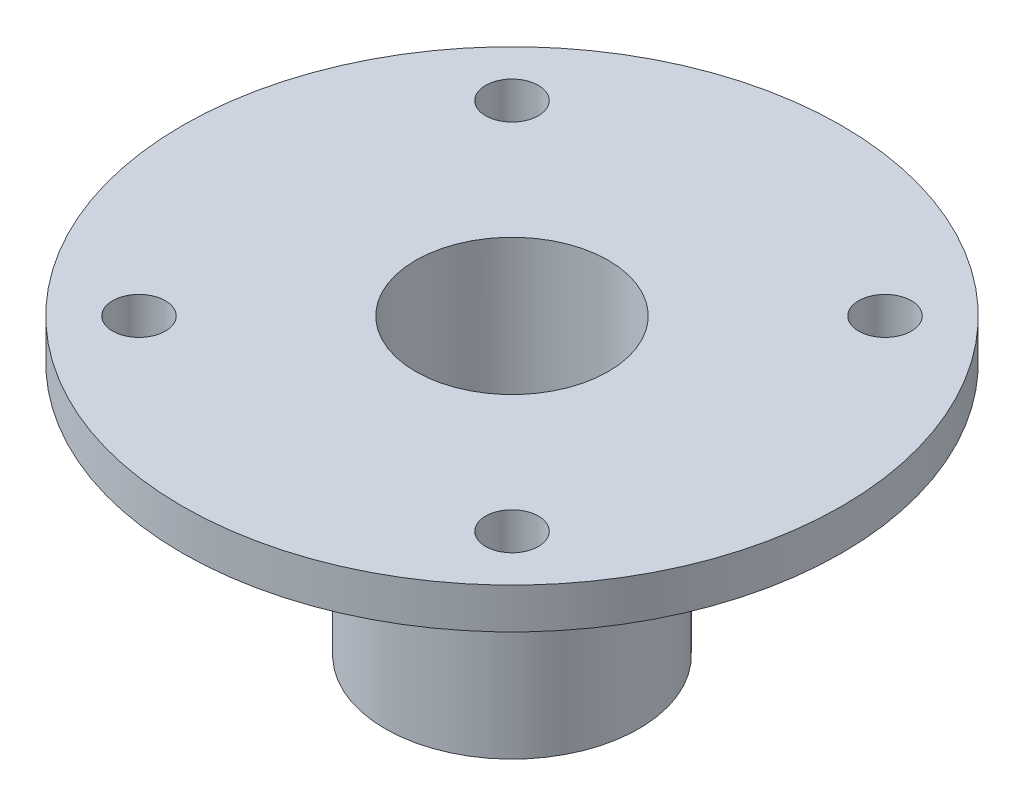
ISO-10303-21;
HEADER;
FILE_DESCRIPTION(('STEP AP214'),'2;1');
FILE_NAME('part.step','',(''),(''),'','','');
FILE_SCHEMA(('AUTOMOTIVE_DESIGN { 1 0 10303 214 1 1 1 1 }'));
ENDSEC;
DATA;
#1=APPLICATION_CONTEXT('core data for automotive mechanical design processes');
#2=APPLICATION_PROTOCOL_DEFINITION('international standard','automotive_design',2000,#1);
#3=PRODUCT_CONTEXT('',#1,'mechanical');
#4=PRODUCT('Part','Part','',(#3));
#5=PRODUCT_RELATED_PRODUCT_CATEGORY('part','',(#4));
#6=PRODUCT_DEFINITION_FORMATION('','',#4);
#7=PRODUCT_DEFINITION_CONTEXT('part definition',#1,'design');
#8=PRODUCT_DEFINITION('design','',#6,#7);
#9=PRODUCT_DEFINITION_SHAPE('','',#8);
#10=(LENGTH_UNIT() NAMED_UNIT(*) SI_UNIT(.MILLI.,.METRE.));
#11=(NAMED_UNIT(*) PLANE_ANGLE_UNIT() SI_UNIT($,.RADIAN.));
#12=(NAMED_UNIT(*) SI_UNIT($,.STERADIAN.) SOLID_ANGLE_UNIT());
#13=UNCERTAINTY_MEASURE_WITH_UNIT(LENGTH_MEASURE(1.E-05),#10,'distance_accuracy_value','');
#14=(GEOMETRIC_REPRESENTATION_CONTEXT(3) GLOBAL_UNCERTAINTY_ASSIGNED_CONTEXT((#13)) GLOBAL_UNIT_ASSIGNED_CONTEXT((#10,
#11,#12)) REPRESENTATION_CONTEXT('',''));
#15=CARTESIAN_POINT('',(0.,0.,0.));
#16=DIRECTION('',(0.,0.,1.));
#17=DIRECTION('',(1.,0.,0.));
#18=AXIS2_PLACEMENT_3D('',#15,#16,#17);
#19=CARTESIAN_POINT('',(0.,0.,0.));
#20=DIRECTION('',(0.,1.,0.));
#21=DIRECTION('',(0.,0.,1.));
#22=AXIS2_PLACEMENT_3D('',#19,#20,#21);
#23=PLANE('',#22);
#24=CARTESIAN_POINT('',(0.,0.,0.));
#25=DIRECTION('',(0.,1.,0.));
#26=DIRECTION('',(0.,0.,1.));
#27=AXIS2_PLACEMENT_3D('',#24,#25,#26);
#28=CIRCLE('',#27,14.5);
#29=CARTESIAN_POINT('',(0.,0.,14.5));
#30=VERTEX_POINT('',#29);
#31=EDGE_CURVE('E10',#30,#30,#28,.T.);
#32=ORIENTED_EDGE('',*,*,#31,.T.);
#33=EDGE_LOOP('',(#32));
#34=FACE_BOUND('',#33,.T.);
#35=CARTESIAN_POINT('',(18.3847763108502,0.,-18.3847763108502));
#36=DIRECTION('',(0.,1.,0.));
#37=DIRECTION('',(0.,0.,1.));
#38=AXIS2_PLACEMENT_3D('',#35,#36,#37);
#39=CIRCLE('',#38,2.6);
#40=CARTESIAN_POINT('',(18.3847763108502,0.,-15.7847763108502));
#41=VERTEX_POINT('',#40);
#42=EDGE_CURVE('E75',#41,#41,#39,.T.);
#43=ORIENTED_EDGE('',*,*,#42,.T.);
#44=EDGE_LOOP('',(#43));
#45=FACE_BOUND('',#44,.T.);
#46=CARTESIAN_POINT('',(-18.3847763108502,0.,18.3847763108502));
#47=DIRECTION('',(0.,1.,0.));
#48=DIRECTION('',(0.,0.,1.));
#49=AXIS2_PLACEMENT_3D('',#46,#47,#48);
#50=CIRCLE('',#49,2.6);
#51=CARTESIAN_POINT('',(-18.3847763108502,0.,20.9847763108502));
#52=VERTEX_POINT('',#51);
#53=EDGE_CURVE('E63',#52,#52,#50,.T.);
#54=ORIENTED_EDGE('',*,*,#53,.T.);
#55=EDGE_LOOP('',(#54));
#56=FACE_BOUND('',#55,.T.);
#57=CARTESIAN_POINT('',(0.,0.,0.));
#58=DIRECTION('',(0.,1.,0.));
#59=DIRECTION('',(0.,0.,1.));
#60=AXIS2_PLACEMENT_3D('',#57,#58,#59);
#61=CIRCLE('',#60,32.5);
#62=CARTESIAN_POINT('',(0.,0.,32.5));
#63=VERTEX_POINT('',#62);
#64=EDGE_CURVE('E48',#63,#63,#61,.T.);
#65=ORIENTED_EDGE('',*,*,#64,.F.);
#66=EDGE_LOOP('',(#65));
#67=FACE_BOUND('',#66,.T.);
#68=CARTESIAN_POINT('',(18.3847763108502,0.,18.3847763108502));
#69=DIRECTION('',(0.,1.,0.));
#70=DIRECTION('',(0.,0.,1.));
#71=AXIS2_PLACEMENT_3D('',#68,#69,#70);
#72=CIRCLE('',#71,2.6);
#73=CARTESIAN_POINT('',(18.3847763108502,0.,20.9847763108502));
#74=VERTEX_POINT('',#73);
#75=EDGE_CURVE('E57',#74,#74,#72,.T.);
#76=ORIENTED_EDGE('',*,*,#75,.T.);
#77=EDGE_LOOP('',(#76));
#78=FACE_BOUND('',#77,.T.);
#79=CARTESIAN_POINT('',(-18.3847763108502,0.,-18.3847763108502));
#80=DIRECTION('',(0.,1.,0.));
#81=DIRECTION('',(0.,0.,1.));
#82=AXIS2_PLACEMENT_3D('',#79,#80,#81);
#83=CIRCLE('',#82,2.6);
#84=CARTESIAN_POINT('',(-18.3847763108502,0.,-15.7847763108502));
#85=VERTEX_POINT('',#84);
#86=EDGE_CURVE('E69',#85,#85,#83,.T.);
#87=ORIENTED_EDGE('',*,*,#86,.T.);
#88=EDGE_LOOP('',(#87));
#89=FACE_BOUND('',#88,.T.);
#90=ADVANCED_FACE('F33',(#34,#45,#56,#67,#78,#89),#23,.F.);
#91=CARTESIAN_POINT('',(0.,4.,0.));
#92=DIRECTION('',(0.,1.,0.));
#93=DIRECTION('',(0.,0.,1.));
#94=AXIS2_PLACEMENT_3D('',#91,#92,#93);
#95=PLANE('',#94);
#96=CARTESIAN_POINT('',(-18.3847763108502,4.,-18.3847763108502));
#97=DIRECTION('',(0.,1.,0.));
#98=DIRECTION('',(0.,0.,1.));
#99=AXIS2_PLACEMENT_3D('',#96,#97,#98);
#100=CIRCLE('',#99,2.6);
#101=CARTESIAN_POINT('',(-18.3847763108502,4.,-15.7847763108502));
#102=VERTEX_POINT('',#101);
#103=EDGE_CURVE('E66',#102,#102,#100,.T.);
#104=ORIENTED_EDGE('',*,*,#103,.F.);
#105=EDGE_LOOP('',(#104));
#106=FACE_BOUND('',#105,.T.);
#107=CARTESIAN_POINT('',(18.3847763108502,4.,18.3847763108502));
#108=DIRECTION('',(0.,1.,0.));
#109=DIRECTION('',(0.,0.,1.));
#110=AXIS2_PLACEMENT_3D('',#107,#108,#109);
#111=CIRCLE('',#110,2.6);
#112=CARTESIAN_POINT('',(18.3847763108502,4.,20.9847763108502));
#113=VERTEX_POINT('',#112);
#114=EDGE_CURVE('E56',#113,#113,#111,.T.);
#115=ORIENTED_EDGE('',*,*,#114,.F.);
#116=EDGE_LOOP('',(#115));
#117=FACE_BOUND('',#116,.T.);
#118=CARTESIAN_POINT('',(0.,4.,0.));
#119=DIRECTION('',(0.,1.,0.));
#120=DIRECTION('',(0.,0.,1.));
#121=AXIS2_PLACEMENT_3D('',#118,#119,#120);
#122=CIRCLE('',#121,32.5);
#123=CARTESIAN_POINT('',(0.,4.,32.5));
#124=VERTEX_POINT('',#123);
#125=EDGE_CURVE('E44',#124,#124,#122,.T.);
#126=ORIENTED_EDGE('',*,*,#125,.T.);
#127=EDGE_LOOP('',(#126));
#128=FACE_BOUND('',#127,.T.);
#129=CARTESIAN_POINT('',(0.,4.,0.));
#130=DIRECTION('',(0.,1.,0.));
#131=DIRECTION('',(0.,0.,1.));
#132=AXIS2_PLACEMENT_3D('',#129,#130,#131);
#133=CIRCLE('',#132,9.5);
#134=CARTESIAN_POINT('',(0.,4.,9.5));
#135=VERTEX_POINT('',#134);
#136=EDGE_CURVE('E52',#135,#135,#133,.T.);
#137=ORIENTED_EDGE('',*,*,#136,.F.);
#138=EDGE_LOOP('',(#137));
#139=FACE_BOUND('',#138,.T.);
#140=CARTESIAN_POINT('',(-18.3847763108502,4.,18.3847763108502));
#141=DIRECTION('',(0.,1.,0.));
#142=DIRECTION('',(0.,0.,1.));
#143=AXIS2_PLACEMENT_3D('',#140,#141,#142);
#144=CIRCLE('',#143,2.6);
#145=CARTESIAN_POINT('',(-18.3847763108502,4.,20.9847763108502));
#146=VERTEX_POINT('',#145);
#147=EDGE_CURVE('E60',#146,#146,#144,.T.);
#148=ORIENTED_EDGE('',*,*,#147,.F.);
#149=EDGE_LOOP('',(#148));
#150=FACE_BOUND('',#149,.T.);
#151=CARTESIAN_POINT('',(18.3847763108502,4.,-18.3847763108502));
#152=DIRECTION('',(0.,1.,0.));
#153=DIRECTION('',(0.,0.,1.));
#154=AXIS2_PLACEMENT_3D('',#151,#152,#153);
#155=CIRCLE('',#154,2.6);
#156=CARTESIAN_POINT('',(18.3847763108502,4.,-15.7847763108502));
#157=VERTEX_POINT('',#156);
#158=EDGE_CURVE('E72',#157,#157,#155,.T.);
#159=ORIENTED_EDGE('',*,*,#158,.F.);
#160=EDGE_LOOP('',(#159));
#161=FACE_BOUND('',#160,.T.);
#162=ADVANCED_FACE('F115',(#106,#117,#128,#139,#150,#161),#95,.T.);
#163=CARTESIAN_POINT('',(0.,4.,0.));
#164=DIRECTION('',(0.,-1.,0.));
#165=DIRECTION('',(0.,0.,-1.));
#166=AXIS2_PLACEMENT_3D('',#163,#164,#165);
#167=CYLINDRICAL_SURFACE('',#166,32.5);
#168=ORIENTED_EDGE('',*,*,#125,.F.);
#169=EDGE_LOOP('',(#168));
#170=FACE_BOUND('',#169,.T.);
#171=ORIENTED_EDGE('',*,*,#64,.T.);
#172=EDGE_LOOP('',(#171));
#173=FACE_BOUND('',#172,.T.);
#174=ADVANCED_FACE('F120',(#170,#173),#167,.T.);
#175=CARTESIAN_POINT('',(0.,4.,0.));
#176=DIRECTION('',(0.,-1.,0.));
#177=DIRECTION('',(0.,0.,-1.));
#178=AXIS2_PLACEMENT_3D('',#175,#176,#177);
#179=CYLINDRICAL_SURFACE('',#178,9.5);
#180=ORIENTED_EDGE('',*,*,#136,.T.);
#181=EDGE_LOOP('',(#180));
#182=FACE_BOUND('',#181,.T.);
#183=CARTESIAN_POINT('',(0.,-17.,0.));
#184=DIRECTION('',(0.,-1.,0.));
#185=DIRECTION('',(0.,0.,-1.));
#186=AXIS2_PLACEMENT_3D('',#183,#184,#185);
#187=CIRCLE('',#186,9.5);
#188=CARTESIAN_POINT('',(0.,-17.,-9.5));
#189=VERTEX_POINT('',#188);
#190=EDGE_CURVE('E78',#189,#189,#187,.T.);
#191=ORIENTED_EDGE('',*,*,#190,.T.);
#192=EDGE_LOOP('',(#191));
#193=FACE_BOUND('',#192,.T.);
#194=ADVANCED_FACE('F126',(#182,#193),#179,.F.);
#195=CARTESIAN_POINT('',(18.3847763108502,4.,18.3847763108502));
#196=DIRECTION('',(0.,-1.,0.));
#197=DIRECTION('',(0.,0.,-1.));
#198=AXIS2_PLACEMENT_3D('',#195,#196,#197);
#199=CYLINDRICAL_SURFACE('',#198,2.6);
#200=ORIENTED_EDGE('',*,*,#114,.T.);
#201=EDGE_LOOP('',(#200));
#202=FACE_BOUND('',#201,.T.);
#203=ORIENTED_EDGE('',*,*,#75,.F.);
#204=EDGE_LOOP('',(#203));
#205=FACE_BOUND('',#204,.T.);
#206=ADVANCED_FACE('F131',(#202,#205),#199,.F.);
#207=CARTESIAN_POINT('',(-18.3847763108502,4.,18.3847763108502));
#208=DIRECTION('',(0.,-1.,0.));
#209=DIRECTION('',(0.,0.,-1.));
#210=AXIS2_PLACEMENT_3D('',#207,#208,#209);
#211=CYLINDRICAL_SURFACE('',#210,2.6);
#212=ORIENTED_EDGE('',*,*,#147,.T.);
#213=EDGE_LOOP('',(#212));
#214=FACE_BOUND('',#213,.T.);
#215=ORIENTED_EDGE('',*,*,#53,.F.);
#216=EDGE_LOOP('',(#215));
#217=FACE_BOUND('',#216,.T.);
#218=ADVANCED_FACE('F143',(#214,#217),#211,.F.);
#219=CARTESIAN_POINT('',(-18.3847763108502,4.,-18.3847763108502));
#220=DIRECTION('',(0.,-1.,0.));
#221=DIRECTION('',(0.,0.,-1.));
#222=AXIS2_PLACEMENT_3D('',#219,#220,#221);
#223=CYLINDRICAL_SURFACE('',#222,2.6);
#224=ORIENTED_EDGE('',*,*,#103,.T.);
#225=EDGE_LOOP('',(#224));
#226=FACE_BOUND('',#225,.T.);
#227=ORIENTED_EDGE('',*,*,#86,.F.);
#228=EDGE_LOOP('',(#227));
#229=FACE_BOUND('',#228,.T.);
#230=ADVANCED_FACE('F110',(#226,#229),#223,.F.);
#231=CARTESIAN_POINT('',(18.3847763108502,4.,-18.3847763108502));
#232=DIRECTION('',(0.,-1.,0.));
#233=DIRECTION('',(0.,0.,-1.));
#234=AXIS2_PLACEMENT_3D('',#231,#232,#233);
#235=CYLINDRICAL_SURFACE('',#234,2.6);
#236=ORIENTED_EDGE('',*,*,#158,.T.);
#237=EDGE_LOOP('',(#236));
#238=FACE_BOUND('',#237,.T.);
#239=ORIENTED_EDGE('',*,*,#42,.F.);
#240=EDGE_LOOP('',(#239));
#241=FACE_BOUND('',#240,.T.);
#242=ADVANCED_FACE('F105',(#238,#241),#235,.F.);
#243=CARTESIAN_POINT('',(0.,-17.,0.));
#244=DIRECTION('',(0.,1.,0.));
#245=DIRECTION('',(0.,0.,1.));
#246=AXIS2_PLACEMENT_3D('',#243,#244,#245);
#247=CYLINDRICAL_SURFACE('',#246,12.5);
#248=CARTESIAN_POINT('',(0.,-2.,0.));
#249=DIRECTION('',(0.,1.,0.));
#250=DIRECTION('',(0.,0.,1.));
#251=AXIS2_PLACEMENT_3D('',#248,#249,#250);
#252=CIRCLE('',#251,12.5);
#253=CARTESIAN_POINT('',(0.,-2.,12.5));
#254=VERTEX_POINT('',#253);
#255=EDGE_CURVE('E40',#254,#254,#252,.F.);
#256=ORIENTED_EDGE('',*,*,#255,.T.);
#257=EDGE_LOOP('',(#256));
#258=FACE_BOUND('',#257,.T.);
#259=CARTESIAN_POINT('',(0.,-25.,0.));
#260=DIRECTION('',(0.,-1.,0.));
#261=DIRECTION('',(0.,0.,-1.));
#262=AXIS2_PLACEMENT_3D('',#259,#260,#261);
#263=CIRCLE('',#262,12.5);
#264=CARTESIAN_POINT('',(0.,-25.,-12.5));
#265=VERTEX_POINT('',#264);
#266=EDGE_CURVE('E83',#265,#265,#263,.T.);
#267=ORIENTED_EDGE('',*,*,#266,.F.);
#268=EDGE_LOOP('',(#267));
#269=FACE_BOUND('',#268,.T.);
#270=ADVANCED_FACE('F100',(#258,#269),#247,.T.);
#271=CARTESIAN_POINT('',(0.,-25.,0.));
#272=DIRECTION('',(0.,-1.,0.));
#273=DIRECTION('',(0.,0.,-1.));
#274=AXIS2_PLACEMENT_3D('',#271,#272,#273);
#275=PLANE('',#274);
#276=CARTESIAN_POINT('',(0.,-25.,0.));
#277=DIRECTION('',(0.,-1.,0.));
#278=DIRECTION('',(0.,0.,-1.));
#279=AXIS2_PLACEMENT_3D('',#276,#277,#278);
#280=CIRCLE('',#279,3.1);
#281=CARTESIAN_POINT('',(0.,-25.,-3.1));
#282=VERTEX_POINT('',#281);
#283=EDGE_CURVE('E89',#282,#282,#280,.T.);
#284=ORIENTED_EDGE('',*,*,#283,.F.);
#285=EDGE_LOOP('',(#284));
#286=FACE_BOUND('',#285,.T.);
#287=ORIENTED_EDGE('',*,*,#266,.T.);
#288=EDGE_LOOP('',(#287));
#289=FACE_BOUND('',#288,.T.);
#290=ADVANCED_FACE('F96',(#286,#289),#275,.T.);
#291=CARTESIAN_POINT('',(0.,-17.,0.));
#292=DIRECTION('',(0.,-1.,0.));
#293=DIRECTION('',(0.,0.,-1.));
#294=AXIS2_PLACEMENT_3D('',#291,#292,#293);
#295=PLANE('',#294);
#296=CARTESIAN_POINT('',(0.,-17.,0.));
#297=DIRECTION('',(0.,-1.,0.));
#298=DIRECTION('',(0.,0.,-1.));
#299=AXIS2_PLACEMENT_3D('',#296,#297,#298);
#300=CIRCLE('',#299,3.1);
#301=CARTESIAN_POINT('',(0.,-17.,-3.1));
#302=VERTEX_POINT('',#301);
#303=EDGE_CURVE('E86',#302,#302,#300,.F.);
#304=ORIENTED_EDGE('',*,*,#303,.F.);
#305=EDGE_LOOP('',(#304));
#306=FACE_BOUND('',#305,.T.);
#307=ORIENTED_EDGE('',*,*,#190,.F.);
#308=EDGE_LOOP('',(#307));
#309=FACE_BOUND('',#308,.T.);
#310=ADVANCED_FACE('F99',(#306,#309),#295,.F.);
#311=CARTESIAN_POINT('',(0.,4.001,0.));
#312=DIRECTION('',(0.,-1.,0.));
#313=DIRECTION('',(0.,0.,-1.));
#314=AXIS2_PLACEMENT_3D('',#311,#312,#313);
#315=CYLINDRICAL_SURFACE('',#314,3.1);
#316=ORIENTED_EDGE('',*,*,#283,.T.);
#317=EDGE_LOOP('',(#316));
#318=FACE_BOUND('',#317,.T.);
#319=ORIENTED_EDGE('',*,*,#303,.T.);
#320=EDGE_LOOP('',(#319));
#321=FACE_BOUND('',#320,.T.);
#322=ADVANCED_FACE('F93',(#318,#321),#315,.F.);
#323=CARTESIAN_POINT('',(0.,-2.,0.));
#324=DIRECTION('',(0.,1.,0.));
#325=DIRECTION('',(0.,0.,1.));
#326=AXIS2_PLACEMENT_3D('',#323,#324,#325);
#327=TOROIDAL_SURFACE('',#326,14.5,2.);
#328=ORIENTED_EDGE('',*,*,#31,.F.);
#329=EDGE_LOOP('',(#328));
#330=FACE_BOUND('',#329,.T.);
#331=ORIENTED_EDGE('',*,*,#255,.F.);
#332=EDGE_LOOP('',(#331));
#333=FACE_BOUND('',#332,.T.);
#334=ADVANCED_FACE('F35',(#330,#333),#327,.F.);
#335=CLOSED_SHELL('',(#90,#162,#174,#194,#206,#218,#230,#242,#270,#290,#310,#322,#334));
#336=MANIFOLD_SOLID_BREP('B2',#335);
#337=ADVANCED_BREP_SHAPE_REPRESENTATION('',(#18,#336),#14);
#338=SHAPE_DEFINITION_REPRESENTATION(#9,#337);
ENDSEC;
END-ISO-10303-21;
